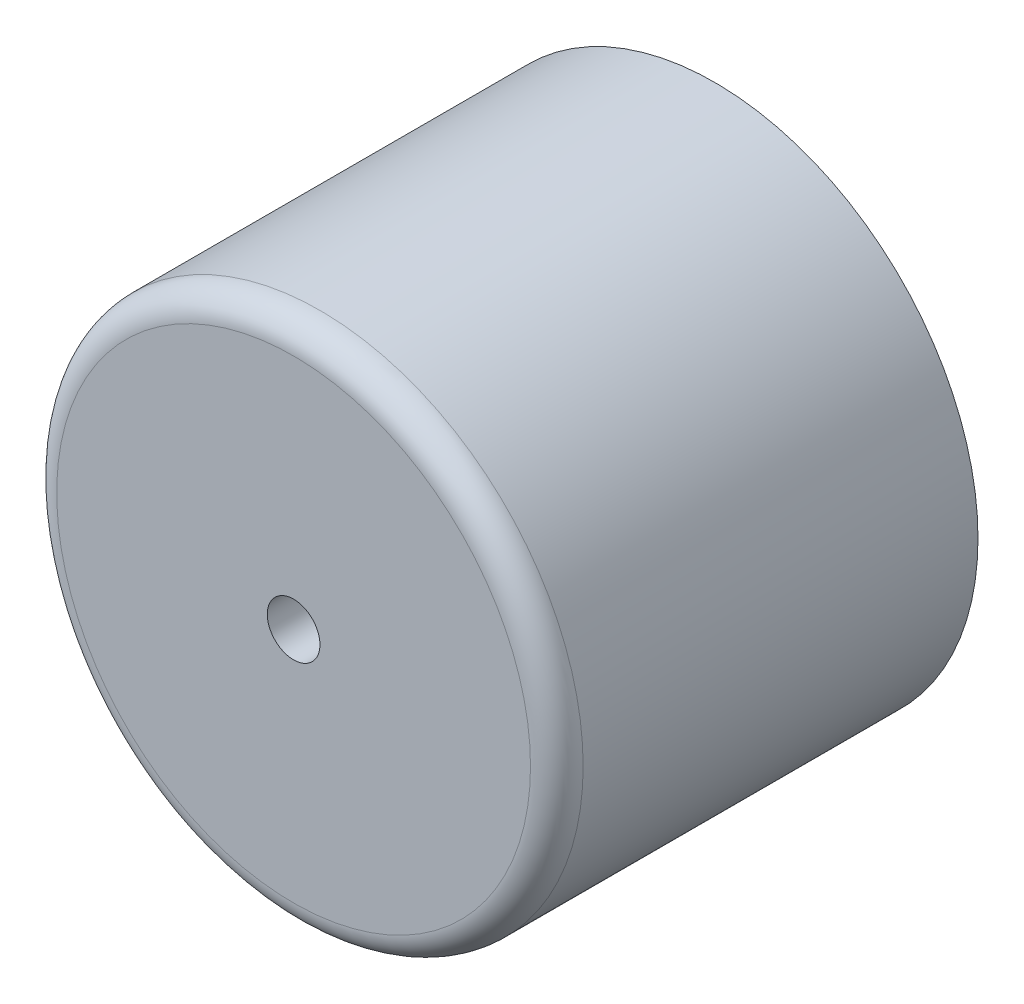
ISO-10303-21;
HEADER;
FILE_DESCRIPTION(('STEP AP214'),'2;1');
FILE_NAME('part.step','',(''),(''),'','','');
FILE_SCHEMA(('AUTOMOTIVE_DESIGN { 1 0 10303 214 1 1 1 1 }'));
ENDSEC;
DATA;
#1=APPLICATION_CONTEXT('core data for automotive mechanical design processes');
#2=APPLICATION_PROTOCOL_DEFINITION('international standard','automotive_design',2000,#1);
#3=PRODUCT_CONTEXT('',#1,'mechanical');
#4=PRODUCT('Part','Part','',(#3));
#5=PRODUCT_RELATED_PRODUCT_CATEGORY('part','',(#4));
#6=PRODUCT_DEFINITION_FORMATION('','',#4);
#7=PRODUCT_DEFINITION_CONTEXT('part definition',#1,'design');
#8=PRODUCT_DEFINITION('design','',#6,#7);
#9=PRODUCT_DEFINITION_SHAPE('','',#8);
#10=(LENGTH_UNIT() NAMED_UNIT(*) SI_UNIT(.MILLI.,.METRE.));
#11=(NAMED_UNIT(*) PLANE_ANGLE_UNIT() SI_UNIT($,.RADIAN.));
#12=(NAMED_UNIT(*) SI_UNIT($,.STERADIAN.) SOLID_ANGLE_UNIT());
#13=UNCERTAINTY_MEASURE_WITH_UNIT(LENGTH_MEASURE(1.E-05),#10,'distance_accuracy_value','');
#14=(GEOMETRIC_REPRESENTATION_CONTEXT(3) GLOBAL_UNCERTAINTY_ASSIGNED_CONTEXT((#13)) GLOBAL_UNIT_ASSIGNED_CONTEXT((#10,
#11,#12)) REPRESENTATION_CONTEXT('',''));
#15=CARTESIAN_POINT('',(0.,0.,0.));
#16=DIRECTION('',(0.,0.,1.));
#17=DIRECTION('',(1.,0.,0.));
#18=AXIS2_PLACEMENT_3D('',#15,#16,#17);
#19=CARTESIAN_POINT('',(0.,0.,80.));
#20=DIRECTION('',(0.,0.,-1.));
#21=DIRECTION('',(-1.,0.,0.));
#22=AXIS2_PLACEMENT_3D('',#19,#20,#21);
#23=CYLINDRICAL_SURFACE('',#22,50.);
#24=CARTESIAN_POINT('',(0.,0.,75.));
#25=DIRECTION('',(0.,0.,1.));
#26=DIRECTION('',(1.,0.,0.));
#27=AXIS2_PLACEMENT_3D('',#24,#25,#26);
#28=CIRCLE('',#27,50.);
#29=CARTESIAN_POINT('',(50.,0.,75.));
#30=VERTEX_POINT('',#29);
#31=EDGE_CURVE('E10',#30,#30,#28,.F.);
#32=ORIENTED_EDGE('',*,*,#31,.T.);
#33=EDGE_LOOP('',(#32));
#34=FACE_BOUND('',#33,.T.);
#35=CARTESIAN_POINT('',(0.,0.,0.));
#36=DIRECTION('',(0.,0.,1.));
#37=DIRECTION('',(1.,0.,0.));
#38=AXIS2_PLACEMENT_3D('',#35,#36,#37);
#39=CIRCLE('',#38,50.);
#40=CARTESIAN_POINT('',(50.,0.,0.));
#41=VERTEX_POINT('',#40);
#42=EDGE_CURVE('E50',#41,#41,#39,.T.);
#43=ORIENTED_EDGE('',*,*,#42,.T.);
#44=EDGE_LOOP('',(#43));
#45=FACE_BOUND('',#44,.T.);
#46=ADVANCED_FACE('F37',(#34,#45),#23,.T.);
#47=CARTESIAN_POINT('',(0.,0.,80.));
#48=DIRECTION('',(0.,0.,1.));
#49=DIRECTION('',(1.,0.,0.));
#50=AXIS2_PLACEMENT_3D('',#47,#48,#49);
#51=PLANE('',#50);
#52=CARTESIAN_POINT('',(0.,0.,80.));
#53=DIRECTION('',(0.,0.,1.));
#54=DIRECTION('',(1.,0.,0.));
#55=AXIS2_PLACEMENT_3D('',#52,#53,#54);
#56=CIRCLE('',#55,5.);
#57=CARTESIAN_POINT('',(5.,0.,80.));
#58=VERTEX_POINT('',#57);
#59=EDGE_CURVE('E58',#58,#58,#56,.T.);
#60=ORIENTED_EDGE('',*,*,#59,.F.);
#61=EDGE_LOOP('',(#60));
#62=FACE_BOUND('',#61,.T.);
#63=CARTESIAN_POINT('',(0.,0.,80.));
#64=DIRECTION('',(0.,0.,1.));
#65=DIRECTION('',(1.,0.,0.));
#66=AXIS2_PLACEMENT_3D('',#63,#64,#65);
#67=CIRCLE('',#66,45.);
#68=CARTESIAN_POINT('',(45.,0.,80.));
#69=VERTEX_POINT('',#68);
#70=EDGE_CURVE('E45',#69,#69,#67,.T.);
#71=ORIENTED_EDGE('',*,*,#70,.T.);
#72=EDGE_LOOP('',(#71));
#73=FACE_BOUND('',#72,.T.);
#74=ADVANCED_FACE('F75',(#62,#73),#51,.T.);
#75=CARTESIAN_POINT('',(0.,0.,0.));
#76=DIRECTION('',(0.,0.,1.));
#77=DIRECTION('',(1.,0.,0.));
#78=AXIS2_PLACEMENT_3D('',#75,#76,#77);
#79=PLANE('',#78);
#80=CARTESIAN_POINT('',(0.,0.,0.));
#81=DIRECTION('',(0.,0.,1.));
#82=DIRECTION('',(1.,0.,0.));
#83=AXIS2_PLACEMENT_3D('',#80,#81,#82);
#84=CIRCLE('',#83,5.);
#85=CARTESIAN_POINT('',(5.,0.,0.));
#86=VERTEX_POINT('',#85);
#87=EDGE_CURVE('E55',#86,#86,#84,.T.);
#88=ORIENTED_EDGE('',*,*,#87,.T.);
#89=EDGE_LOOP('',(#88));
#90=FACE_BOUND('',#89,.T.);
#91=ORIENTED_EDGE('',*,*,#42,.F.);
#92=EDGE_LOOP('',(#91));
#93=FACE_BOUND('',#92,.T.);
#94=ADVANCED_FACE('F66',(#90,#93),#79,.F.);
#95=CARTESIAN_POINT('',(0.,0.,75.));
#96=DIRECTION('',(0.,0.,1.));
#97=DIRECTION('',(1.,0.,0.));
#98=AXIS2_PLACEMENT_3D('',#95,#96,#97);
#99=TOROIDAL_SURFACE('',#98,45.,5.);
#100=ORIENTED_EDGE('',*,*,#31,.F.);
#101=EDGE_LOOP('',(#100));
#102=FACE_BOUND('',#101,.T.);
#103=ORIENTED_EDGE('',*,*,#70,.F.);
#104=EDGE_LOOP('',(#103));
#105=FACE_BOUND('',#104,.T.);
#106=ADVANCED_FACE('F39',(#102,#105),#99,.T.);
#107=CARTESIAN_POINT('',(0.,0.,0.));
#108=DIRECTION('',(0.,0.,1.));
#109=DIRECTION('',(1.,0.,0.));
#110=AXIS2_PLACEMENT_3D('',#107,#108,#109);
#111=CYLINDRICAL_SURFACE('',#110,5.);
#112=ORIENTED_EDGE('',*,*,#87,.F.);
#113=EDGE_LOOP('',(#112));
#114=FACE_BOUND('',#113,.T.);
#115=ORIENTED_EDGE('',*,*,#59,.T.);
#116=EDGE_LOOP('',(#115));
#117=FACE_BOUND('',#116,.T.);
#118=ADVANCED_FACE('F69',(#114,#117),#111,.F.);
#119=CLOSED_SHELL('',(#46,#74,#94,#106,#118));
#120=MANIFOLD_SOLID_BREP('B2',#119);
#121=ADVANCED_BREP_SHAPE_REPRESENTATION('',(#18,#120),#14);
#122=SHAPE_DEFINITION_REPRESENTATION(#9,#121);
ENDSEC;
END-ISO-10303-21;
